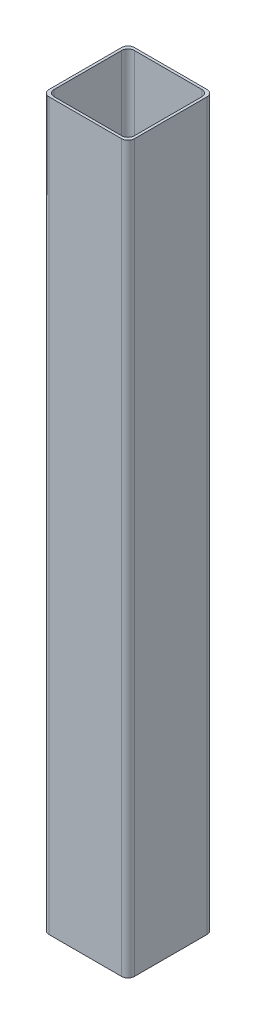
ISO-10303-21;
HEADER;
FILE_DESCRIPTION(('STEP AP214'),'2;1');
FILE_NAME('part.step','',(''),(''),'','','');
FILE_SCHEMA(('AUTOMOTIVE_DESIGN { 1 0 10303 214 1 1 1 1 }'));
ENDSEC;
DATA;
#1=APPLICATION_CONTEXT('core data for automotive mechanical design processes');
#2=APPLICATION_PROTOCOL_DEFINITION('international standard','automotive_design',2000,#1);
#3=PRODUCT_CONTEXT('',#1,'mechanical');
#4=PRODUCT('Part','Part','',(#3));
#5=PRODUCT_RELATED_PRODUCT_CATEGORY('part','',(#4));
#6=PRODUCT_DEFINITION_FORMATION('','',#4);
#7=PRODUCT_DEFINITION_CONTEXT('part definition',#1,'design');
#8=PRODUCT_DEFINITION('design','',#6,#7);
#9=PRODUCT_DEFINITION_SHAPE('','',#8);
#10=(LENGTH_UNIT() NAMED_UNIT(*) SI_UNIT(.MILLI.,.METRE.));
#11=(NAMED_UNIT(*) PLANE_ANGLE_UNIT() SI_UNIT($,.RADIAN.));
#12=(NAMED_UNIT(*) SI_UNIT($,.STERADIAN.) SOLID_ANGLE_UNIT());
#13=UNCERTAINTY_MEASURE_WITH_UNIT(LENGTH_MEASURE(1.E-05),#10,'distance_accuracy_value','');
#14=(GEOMETRIC_REPRESENTATION_CONTEXT(3) GLOBAL_UNCERTAINTY_ASSIGNED_CONTEXT((#13)) GLOBAL_UNIT_ASSIGNED_CONTEXT((#10,
#11,#12)) REPRESENTATION_CONTEXT('',''));
#15=CARTESIAN_POINT('',(0.,0.,0.));
#16=DIRECTION('',(0.,0.,1.));
#17=DIRECTION('',(1.,0.,0.));
#18=AXIS2_PLACEMENT_3D('',#15,#16,#17);
#19=CARTESIAN_POINT('',(0.,170.,0.));
#20=DIRECTION('',(0.,1.,0.));
#21=DIRECTION('',(0.,0.,1.));
#22=AXIS2_PLACEMENT_3D('',#19,#20,#21);
#23=PLANE('',#22);
#24=DIRECTION('',(-1.,0.,0.));
#25=VECTOR('',#24,1.);
#26=CARTESIAN_POINT('',(20.,170.,-20.));
#27=LINE('',#26,#25);
#28=CARTESIAN_POINT('',(17.,170.,-20.));
#29=VERTEX_POINT('',#28);
#30=CARTESIAN_POINT('',(-17.,170.,-20.));
#31=VERTEX_POINT('',#30);
#32=EDGE_CURVE('E183',#29,#31,#27,.T.);
#33=ORIENTED_EDGE('',*,*,#32,.T.);
#34=CARTESIAN_POINT('',(-17.,170.,-17.));
#35=DIRECTION('',(0.,1.,0.));
#36=DIRECTION('',(0.,0.,1.));
#37=AXIS2_PLACEMENT_3D('',#34,#35,#36);
#38=CIRCLE('',#37,3.);
#39=CARTESIAN_POINT('',(-20.,170.,-17.));
#40=VERTEX_POINT('',#39);
#41=EDGE_CURVE('E203',#31,#40,#38,.T.);
#42=ORIENTED_EDGE('',*,*,#41,.T.);
#43=DIRECTION('',(0.,0.,1.));
#44=VECTOR('',#43,1.);
#45=CARTESIAN_POINT('',(-20.,170.,20.));
#46=LINE('',#45,#44);
#47=CARTESIAN_POINT('',(-20.,170.,17.));
#48=VERTEX_POINT('',#47);
#49=EDGE_CURVE('E165',#40,#48,#46,.T.);
#50=ORIENTED_EDGE('',*,*,#49,.T.);
#51=CARTESIAN_POINT('',(-17.,170.,17.));
#52=DIRECTION('',(0.,1.,0.));
#53=DIRECTION('',(0.,0.,1.));
#54=AXIS2_PLACEMENT_3D('',#51,#52,#53);
#55=CIRCLE('',#54,3.);
#56=CARTESIAN_POINT('',(-17.,170.,20.));
#57=VERTEX_POINT('',#56);
#58=EDGE_CURVE('E199',#48,#57,#55,.T.);
#59=ORIENTED_EDGE('',*,*,#58,.T.);
#60=DIRECTION('',(1.,0.,0.));
#61=VECTOR('',#60,1.);
#62=CARTESIAN_POINT('',(20.,170.,20.));
#63=LINE('',#62,#61);
#64=CARTESIAN_POINT('',(17.,170.,20.));
#65=VERTEX_POINT('',#64);
#66=EDGE_CURVE('E275',#57,#65,#63,.T.);
#67=ORIENTED_EDGE('',*,*,#66,.T.);
#68=CARTESIAN_POINT('',(17.,170.,17.));
#69=DIRECTION('',(0.,1.,0.));
#70=DIRECTION('',(0.,0.,1.));
#71=AXIS2_PLACEMENT_3D('',#68,#69,#70);
#72=CIRCLE('',#71,3.);
#73=CARTESIAN_POINT('',(20.,170.,17.));
#74=VERTEX_POINT('',#73);
#75=EDGE_CURVE('E197',#65,#74,#72,.T.);
#76=ORIENTED_EDGE('',*,*,#75,.T.);
#77=DIRECTION('',(0.,0.,-1.));
#78=VECTOR('',#77,1.);
#79=CARTESIAN_POINT('',(20.,170.,20.));
#80=LINE('',#79,#78);
#81=CARTESIAN_POINT('',(20.,170.,-17.));
#82=VERTEX_POINT('',#81);
#83=EDGE_CURVE('E277',#74,#82,#80,.T.);
#84=ORIENTED_EDGE('',*,*,#83,.T.);
#85=CARTESIAN_POINT('',(17.,170.,-17.));
#86=DIRECTION('',(0.,1.,0.));
#87=DIRECTION('',(0.,0.,1.));
#88=AXIS2_PLACEMENT_3D('',#85,#86,#87);
#89=CIRCLE('',#88,3.);
#90=EDGE_CURVE('E201',#82,#29,#89,.T.);
#91=ORIENTED_EDGE('',*,*,#90,.T.);
#92=EDGE_LOOP('',(#33,#42,#50,#59,#67,#76,#84,#91));
#93=FACE_BOUND('',#92,.T.);
#94=DIRECTION('',(0.,0.,-1.));
#95=VECTOR('',#94,1.);
#96=CARTESIAN_POINT('',(18.8,170.,18.8));
#97=LINE('',#96,#95);
#98=CARTESIAN_POINT('',(18.8,170.,15.8));
#99=VERTEX_POINT('',#98);
#100=CARTESIAN_POINT('',(18.8,170.,-15.8));
#101=VERTEX_POINT('',#100);
#102=EDGE_CURVE('E261',#99,#101,#97,.T.);
#103=ORIENTED_EDGE('',*,*,#102,.F.);
#104=CARTESIAN_POINT('',(15.8,170.,15.8));
#105=DIRECTION('',(0.,1.,0.));
#106=DIRECTION('',(0.,0.,1.));
#107=AXIS2_PLACEMENT_3D('',#104,#105,#106);
#108=CIRCLE('',#107,3.);
#109=CARTESIAN_POINT('',(15.8,170.,18.8));
#110=VERTEX_POINT('',#109);
#111=EDGE_CURVE('E240',#99,#110,#108,.F.);
#112=ORIENTED_EDGE('',*,*,#111,.T.);
#113=DIRECTION('',(1.,0.,0.));
#114=VECTOR('',#113,1.);
#115=CARTESIAN_POINT('',(18.8,170.,18.8));
#116=LINE('',#115,#114);
#117=CARTESIAN_POINT('',(-15.8,170.,18.8));
#118=VERTEX_POINT('',#117);
#119=EDGE_CURVE('E256',#118,#110,#116,.T.);
#120=ORIENTED_EDGE('',*,*,#119,.F.);
#121=CARTESIAN_POINT('',(-15.8,170.,15.8));
#122=DIRECTION('',(0.,1.,0.));
#123=DIRECTION('',(0.,0.,1.));
#124=AXIS2_PLACEMENT_3D('',#121,#122,#123);
#125=CIRCLE('',#124,3.);
#126=CARTESIAN_POINT('',(-18.8,170.,15.8));
#127=VERTEX_POINT('',#126);
#128=EDGE_CURVE('E244',#118,#127,#125,.F.);
#129=ORIENTED_EDGE('',*,*,#128,.T.);
#130=DIRECTION('',(0.,0.,1.));
#131=VECTOR('',#130,1.);
#132=CARTESIAN_POINT('',(-18.8,170.,18.8));
#133=LINE('',#132,#131);
#134=CARTESIAN_POINT('',(-18.8,170.,-15.8));
#135=VERTEX_POINT('',#134);
#136=EDGE_CURVE('E174',#135,#127,#133,.T.);
#137=ORIENTED_EDGE('',*,*,#136,.F.);
#138=CARTESIAN_POINT('',(-15.8,170.,-15.8));
#139=DIRECTION('',(0.,1.,0.));
#140=DIRECTION('',(0.,0.,1.));
#141=AXIS2_PLACEMENT_3D('',#138,#139,#140);
#142=CIRCLE('',#141,3.);
#143=CARTESIAN_POINT('',(-15.8,170.,-18.8));
#144=VERTEX_POINT('',#143);
#145=EDGE_CURVE('E11',#135,#144,#142,.F.);
#146=ORIENTED_EDGE('',*,*,#145,.T.);
#147=DIRECTION('',(-1.,0.,0.));
#148=VECTOR('',#147,1.);
#149=CARTESIAN_POINT('',(18.8,170.,-18.8));
#150=LINE('',#149,#148);
#151=CARTESIAN_POINT('',(15.8,170.,-18.8));
#152=VERTEX_POINT('',#151);
#153=EDGE_CURVE('E180',#152,#144,#150,.T.);
#154=ORIENTED_EDGE('',*,*,#153,.F.);
#155=CARTESIAN_POINT('',(15.8,170.,-15.8));
#156=DIRECTION('',(0.,1.,0.));
#157=DIRECTION('',(0.,0.,1.));
#158=AXIS2_PLACEMENT_3D('',#155,#156,#157);
#159=CIRCLE('',#158,3.);
#160=EDGE_CURVE('E236',#152,#101,#159,.F.);
#161=ORIENTED_EDGE('',*,*,#160,.T.);
#162=EDGE_LOOP('',(#103,#112,#120,#129,#137,#146,#154,#161));
#163=FACE_BOUND('',#162,.T.);
#164=ADVANCED_FACE('F32',(#93,#163),#23,.T.);
#165=CARTESIAN_POINT('',(0.,-170.,0.));
#166=DIRECTION('',(0.,1.,0.));
#167=DIRECTION('',(0.,0.,1.));
#168=AXIS2_PLACEMENT_3D('',#165,#166,#167);
#169=PLANE('',#168);
#170=DIRECTION('',(0.,0.,1.));
#171=VECTOR('',#170,1.);
#172=CARTESIAN_POINT('',(-20.,-170.,20.));
#173=LINE('',#172,#171);
#174=CARTESIAN_POINT('',(-20.,-170.,-17.));
#175=VERTEX_POINT('',#174);
#176=CARTESIAN_POINT('',(-20.,-170.,17.));
#177=VERTEX_POINT('',#176);
#178=EDGE_CURVE('E162',#175,#177,#173,.T.);
#179=ORIENTED_EDGE('',*,*,#178,.F.);
#180=CARTESIAN_POINT('',(-17.,-170.,-17.));
#181=DIRECTION('',(0.,1.,0.));
#182=DIRECTION('',(0.,0.,1.));
#183=AXIS2_PLACEMENT_3D('',#180,#181,#182);
#184=CIRCLE('',#183,3.);
#185=CARTESIAN_POINT('',(-17.,-170.,-20.));
#186=VERTEX_POINT('',#185);
#187=EDGE_CURVE('E145',#175,#186,#184,.F.);
#188=ORIENTED_EDGE('',*,*,#187,.T.);
#189=DIRECTION('',(-1.,0.,0.));
#190=VECTOR('',#189,1.);
#191=CARTESIAN_POINT('',(20.,-170.,-20.));
#192=LINE('',#191,#190);
#193=CARTESIAN_POINT('',(17.,-170.,-20.));
#194=VERTEX_POINT('',#193);
#195=EDGE_CURVE('E188',#194,#186,#192,.T.);
#196=ORIENTED_EDGE('',*,*,#195,.F.);
#197=CARTESIAN_POINT('',(17.,-170.,-17.));
#198=DIRECTION('',(0.,1.,0.));
#199=DIRECTION('',(0.,0.,1.));
#200=AXIS2_PLACEMENT_3D('',#197,#198,#199);
#201=CIRCLE('',#200,3.);
#202=CARTESIAN_POINT('',(20.,-170.,-17.));
#203=VERTEX_POINT('',#202);
#204=EDGE_CURVE('E156',#194,#203,#201,.F.);
#205=ORIENTED_EDGE('',*,*,#204,.T.);
#206=DIRECTION('',(0.,0.,-1.));
#207=VECTOR('',#206,1.);
#208=CARTESIAN_POINT('',(20.,-170.,20.));
#209=LINE('',#208,#207);
#210=CARTESIAN_POINT('',(20.,-170.,17.));
#211=VERTEX_POINT('',#210);
#212=EDGE_CURVE('E177',#211,#203,#209,.T.);
#213=ORIENTED_EDGE('',*,*,#212,.F.);
#214=CARTESIAN_POINT('',(17.,-170.,17.));
#215=DIRECTION('',(0.,1.,0.));
#216=DIRECTION('',(0.,0.,1.));
#217=AXIS2_PLACEMENT_3D('',#214,#215,#216);
#218=CIRCLE('',#217,3.);
#219=CARTESIAN_POINT('',(17.,-170.,20.));
#220=VERTEX_POINT('',#219);
#221=EDGE_CURVE('E166',#211,#220,#218,.F.);
#222=ORIENTED_EDGE('',*,*,#221,.T.);
#223=DIRECTION('',(1.,0.,0.));
#224=VECTOR('',#223,1.);
#225=CARTESIAN_POINT('',(20.,-170.,20.));
#226=LINE('',#225,#224);
#227=CARTESIAN_POINT('',(-17.,-170.,20.));
#228=VERTEX_POINT('',#227);
#229=EDGE_CURVE('E173',#228,#220,#226,.T.);
#230=ORIENTED_EDGE('',*,*,#229,.F.);
#231=CARTESIAN_POINT('',(-17.,-170.,17.));
#232=DIRECTION('',(0.,1.,0.));
#233=DIRECTION('',(0.,0.,1.));
#234=AXIS2_PLACEMENT_3D('',#231,#232,#233);
#235=CIRCLE('',#234,3.);
#236=EDGE_CURVE('E172',#228,#177,#235,.F.);
#237=ORIENTED_EDGE('',*,*,#236,.T.);
#238=EDGE_LOOP('',(#179,#188,#196,#205,#213,#222,#230,#237));
#239=FACE_BOUND('',#238,.T.);
#240=DIRECTION('',(0.,0.,1.));
#241=VECTOR('',#240,1.);
#242=CARTESIAN_POINT('',(-18.8,-170.,18.8));
#243=LINE('',#242,#241);
#244=CARTESIAN_POINT('',(-18.8,-170.,-15.8));
#245=VERTEX_POINT('',#244);
#246=CARTESIAN_POINT('',(-18.8,-170.,15.8));
#247=VERTEX_POINT('',#246);
#248=EDGE_CURVE('E248',#245,#247,#243,.T.);
#249=ORIENTED_EDGE('',*,*,#248,.T.);
#250=CARTESIAN_POINT('',(-15.8,-170.,15.8));
#251=DIRECTION('',(0.,1.,0.));
#252=DIRECTION('',(0.,0.,1.));
#253=AXIS2_PLACEMENT_3D('',#250,#251,#252);
#254=CIRCLE('',#253,3.);
#255=CARTESIAN_POINT('',(-15.8,-170.,18.8));
#256=VERTEX_POINT('',#255);
#257=EDGE_CURVE('E242',#247,#256,#254,.T.);
#258=ORIENTED_EDGE('',*,*,#257,.T.);
#259=DIRECTION('',(1.,0.,0.));
#260=VECTOR('',#259,1.);
#261=CARTESIAN_POINT('',(18.8,-170.,18.8));
#262=LINE('',#261,#260);
#263=CARTESIAN_POINT('',(15.8,-170.,18.8));
#264=VERTEX_POINT('',#263);
#265=EDGE_CURVE('E267',#256,#264,#262,.T.);
#266=ORIENTED_EDGE('',*,*,#265,.T.);
#267=CARTESIAN_POINT('',(15.8,-170.,15.8));
#268=DIRECTION('',(0.,1.,0.));
#269=DIRECTION('',(0.,0.,1.));
#270=AXIS2_PLACEMENT_3D('',#267,#268,#269);
#271=CIRCLE('',#270,3.);
#272=CARTESIAN_POINT('',(18.8,-170.,15.8));
#273=VERTEX_POINT('',#272);
#274=EDGE_CURVE('E238',#264,#273,#271,.T.);
#275=ORIENTED_EDGE('',*,*,#274,.T.);
#276=DIRECTION('',(0.,0.,-1.));
#277=VECTOR('',#276,1.);
#278=CARTESIAN_POINT('',(18.8,-170.,18.8));
#279=LINE('',#278,#277);
#280=CARTESIAN_POINT('',(18.8,-170.,-15.8));
#281=VERTEX_POINT('',#280);
#282=EDGE_CURVE('E270',#273,#281,#279,.T.);
#283=ORIENTED_EDGE('',*,*,#282,.T.);
#284=CARTESIAN_POINT('',(15.8,-170.,-15.8));
#285=DIRECTION('',(0.,1.,0.));
#286=DIRECTION('',(0.,0.,1.));
#287=AXIS2_PLACEMENT_3D('',#284,#285,#286);
#288=CIRCLE('',#287,3.);
#289=CARTESIAN_POINT('',(15.8,-170.,-18.8));
#290=VERTEX_POINT('',#289);
#291=EDGE_CURVE('E234',#281,#290,#288,.T.);
#292=ORIENTED_EDGE('',*,*,#291,.T.);
#293=DIRECTION('',(-1.,0.,0.));
#294=VECTOR('',#293,1.);
#295=CARTESIAN_POINT('',(18.8,-170.,-18.8));
#296=LINE('',#295,#294);
#297=CARTESIAN_POINT('',(-15.8,-170.,-18.8));
#298=VERTEX_POINT('',#297);
#299=EDGE_CURVE('E249',#290,#298,#296,.T.);
#300=ORIENTED_EDGE('',*,*,#299,.T.);
#301=CARTESIAN_POINT('',(-15.8,-170.,-15.8));
#302=DIRECTION('',(0.,1.,0.));
#303=DIRECTION('',(0.,0.,1.));
#304=AXIS2_PLACEMENT_3D('',#301,#302,#303);
#305=CIRCLE('',#304,3.);
#306=EDGE_CURVE('E40',#298,#245,#305,.T.);
#307=ORIENTED_EDGE('',*,*,#306,.T.);
#308=EDGE_LOOP('',(#249,#258,#266,#275,#283,#292,#300,#307));
#309=FACE_BOUND('',#308,.T.);
#310=ADVANCED_FACE('F169',(#239,#309),#169,.F.);
#311=CARTESIAN_POINT('',(-20.,170.,20.));
#312=DIRECTION('',(1.,0.,0.));
#313=DIRECTION('',(0.,0.,-1.));
#314=AXIS2_PLACEMENT_3D('',#311,#312,#313);
#315=PLANE('',#314);
#316=ORIENTED_EDGE('',*,*,#49,.F.);
#317=DIRECTION('',(0.,-1.,0.));
#318=VECTOR('',#317,1.);
#319=CARTESIAN_POINT('',(-20.,170.,-17.));
#320=LINE('',#319,#318);
#321=EDGE_CURVE('E149',#40,#175,#320,.T.);
#322=ORIENTED_EDGE('',*,*,#321,.T.);
#323=ORIENTED_EDGE('',*,*,#178,.T.);
#324=DIRECTION('',(0.,-1.,0.));
#325=VECTOR('',#324,1.);
#326=CARTESIAN_POINT('',(-20.,170.,17.));
#327=LINE('',#326,#325);
#328=EDGE_CURVE('E167',#177,#48,#327,.F.);
#329=ORIENTED_EDGE('',*,*,#328,.T.);
#330=EDGE_LOOP('',(#316,#322,#323,#329));
#331=FACE_BOUND('',#330,.T.);
#332=ADVANCED_FACE('F161',(#331),#315,.F.);
#333=CARTESIAN_POINT('',(20.,170.,20.));
#334=DIRECTION('',(0.,0.,-1.));
#335=DIRECTION('',(-1.,0.,0.));
#336=AXIS2_PLACEMENT_3D('',#333,#334,#335);
#337=PLANE('',#336);
#338=ORIENTED_EDGE('',*,*,#66,.F.);
#339=DIRECTION('',(0.,-1.,0.));
#340=VECTOR('',#339,1.);
#341=CARTESIAN_POINT('',(-17.,170.,20.));
#342=LINE('',#341,#340);
#343=EDGE_CURVE('E231',#57,#228,#342,.T.);
#344=ORIENTED_EDGE('',*,*,#343,.T.);
#345=ORIENTED_EDGE('',*,*,#229,.T.);
#346=DIRECTION('',(0.,-1.,0.));
#347=VECTOR('',#346,1.);
#348=CARTESIAN_POINT('',(17.,170.,20.));
#349=LINE('',#348,#347);
#350=EDGE_CURVE('E229',#220,#65,#349,.F.);
#351=ORIENTED_EDGE('',*,*,#350,.T.);
#352=EDGE_LOOP('',(#338,#344,#345,#351));
#353=FACE_BOUND('',#352,.T.);
#354=ADVANCED_FACE('F299',(#353),#337,.F.);
#355=CARTESIAN_POINT('',(20.,170.,20.));
#356=DIRECTION('',(-1.,0.,0.));
#357=DIRECTION('',(0.,0.,1.));
#358=AXIS2_PLACEMENT_3D('',#355,#356,#357);
#359=PLANE('',#358);
#360=ORIENTED_EDGE('',*,*,#212,.T.);
#361=DIRECTION('',(0.,-1.,0.));
#362=VECTOR('',#361,1.);
#363=CARTESIAN_POINT('',(20.,170.,-17.));
#364=LINE('',#363,#362);
#365=EDGE_CURVE('E208',#203,#82,#364,.F.);
#366=ORIENTED_EDGE('',*,*,#365,.T.);
#367=ORIENTED_EDGE('',*,*,#83,.F.);
#368=DIRECTION('',(0.,-1.,0.));
#369=VECTOR('',#368,1.);
#370=CARTESIAN_POINT('',(20.,170.,17.));
#371=LINE('',#370,#369);
#372=EDGE_CURVE('E205',#74,#211,#371,.T.);
#373=ORIENTED_EDGE('',*,*,#372,.T.);
#374=EDGE_LOOP('',(#360,#366,#367,#373));
#375=FACE_BOUND('',#374,.T.);
#376=ADVANCED_FACE('F292',(#375),#359,.F.);
#377=CARTESIAN_POINT('',(20.,170.,-20.));
#378=DIRECTION('',(0.,0.,1.));
#379=DIRECTION('',(1.,0.,0.));
#380=AXIS2_PLACEMENT_3D('',#377,#378,#379);
#381=PLANE('',#380);
#382=ORIENTED_EDGE('',*,*,#195,.T.);
#383=DIRECTION('',(0.,-1.,0.));
#384=VECTOR('',#383,1.);
#385=CARTESIAN_POINT('',(-17.,170.,-20.));
#386=LINE('',#385,#384);
#387=EDGE_CURVE('E150',#186,#31,#386,.F.);
#388=ORIENTED_EDGE('',*,*,#387,.T.);
#389=ORIENTED_EDGE('',*,*,#32,.F.);
#390=DIRECTION('',(0.,-1.,0.));
#391=VECTOR('',#390,1.);
#392=CARTESIAN_POINT('',(17.,170.,-20.));
#393=LINE('',#392,#391);
#394=EDGE_CURVE('E155',#29,#194,#393,.T.);
#395=ORIENTED_EDGE('',*,*,#394,.T.);
#396=EDGE_LOOP('',(#382,#388,#389,#395));
#397=FACE_BOUND('',#396,.T.);
#398=ADVANCED_FACE('F286',(#397),#381,.F.);
#399=CARTESIAN_POINT('',(18.8,170.,18.8));
#400=DIRECTION('',(0.,0.,-1.));
#401=DIRECTION('',(-1.,0.,0.));
#402=AXIS2_PLACEMENT_3D('',#399,#400,#401);
#403=PLANE('',#402);
#404=ORIENTED_EDGE('',*,*,#119,.T.);
#405=DIRECTION('',(0.,-1.,0.));
#406=VECTOR('',#405,1.);
#407=CARTESIAN_POINT('',(15.8,-170.,18.8));
#408=LINE('',#407,#406);
#409=EDGE_CURVE('E221',#110,#264,#408,.T.);
#410=ORIENTED_EDGE('',*,*,#409,.T.);
#411=ORIENTED_EDGE('',*,*,#265,.F.);
#412=DIRECTION('',(0.,-1.,0.));
#413=VECTOR('',#412,1.);
#414=CARTESIAN_POINT('',(-15.8,170.,18.8));
#415=LINE('',#414,#413);
#416=EDGE_CURVE('E219',#256,#118,#415,.F.);
#417=ORIENTED_EDGE('',*,*,#416,.T.);
#418=EDGE_LOOP('',(#404,#410,#411,#417));
#419=FACE_BOUND('',#418,.T.);
#420=ADVANCED_FACE('F318',(#419),#403,.T.);
#421=CARTESIAN_POINT('',(18.8,170.,18.8));
#422=DIRECTION('',(-1.,0.,0.));
#423=DIRECTION('',(0.,0.,1.));
#424=AXIS2_PLACEMENT_3D('',#421,#422,#423);
#425=PLANE('',#424);
#426=ORIENTED_EDGE('',*,*,#102,.T.);
#427=DIRECTION('',(0.,-1.,0.));
#428=VECTOR('',#427,1.);
#429=CARTESIAN_POINT('',(18.8,-170.,-15.8));
#430=LINE('',#429,#428);
#431=EDGE_CURVE('E212',#101,#281,#430,.T.);
#432=ORIENTED_EDGE('',*,*,#431,.T.);
#433=ORIENTED_EDGE('',*,*,#282,.F.);
#434=DIRECTION('',(0.,-1.,0.));
#435=VECTOR('',#434,1.);
#436=CARTESIAN_POINT('',(18.8,170.,15.8));
#437=LINE('',#436,#435);
#438=EDGE_CURVE('E210',#273,#99,#437,.F.);
#439=ORIENTED_EDGE('',*,*,#438,.T.);
#440=EDGE_LOOP('',(#426,#432,#433,#439));
#441=FACE_BOUND('',#440,.T.);
#442=ADVANCED_FACE('F357',(#441),#425,.T.);
#443=CARTESIAN_POINT('',(18.8,170.,-18.8));
#444=DIRECTION('',(0.,0.,1.));
#445=DIRECTION('',(1.,0.,0.));
#446=AXIS2_PLACEMENT_3D('',#443,#444,#445);
#447=PLANE('',#446);
#448=ORIENTED_EDGE('',*,*,#299,.F.);
#449=DIRECTION('',(0.,-1.,0.));
#450=VECTOR('',#449,1.);
#451=CARTESIAN_POINT('',(15.8,170.,-18.8));
#452=LINE('',#451,#450);
#453=EDGE_CURVE('E52',#290,#152,#452,.F.);
#454=ORIENTED_EDGE('',*,*,#453,.T.);
#455=ORIENTED_EDGE('',*,*,#153,.T.);
#456=DIRECTION('',(0.,-1.,0.));
#457=VECTOR('',#456,1.);
#458=CARTESIAN_POINT('',(-15.8,-170.,-18.8));
#459=LINE('',#458,#457);
#460=EDGE_CURVE('E215',#144,#298,#459,.T.);
#461=ORIENTED_EDGE('',*,*,#460,.T.);
#462=EDGE_LOOP('',(#448,#454,#455,#461));
#463=FACE_BOUND('',#462,.T.);
#464=ADVANCED_FACE('F259',(#463),#447,.T.);
#465=CARTESIAN_POINT('',(-18.8,170.,18.8));
#466=DIRECTION('',(1.,0.,0.));
#467=DIRECTION('',(0.,0.,-1.));
#468=AXIS2_PLACEMENT_3D('',#465,#466,#467);
#469=PLANE('',#468);
#470=ORIENTED_EDGE('',*,*,#136,.T.);
#471=DIRECTION('',(0.,-1.,0.));
#472=VECTOR('',#471,1.);
#473=CARTESIAN_POINT('',(-18.8,-170.,15.8));
#474=LINE('',#473,#472);
#475=EDGE_CURVE('E226',#127,#247,#474,.T.);
#476=ORIENTED_EDGE('',*,*,#475,.T.);
#477=ORIENTED_EDGE('',*,*,#248,.F.);
#478=DIRECTION('',(0.,-1.,0.));
#479=VECTOR('',#478,1.);
#480=CARTESIAN_POINT('',(-18.8,170.,-15.8));
#481=LINE('',#480,#479);
#482=EDGE_CURVE('E224',#245,#135,#481,.F.);
#483=ORIENTED_EDGE('',*,*,#482,.T.);
#484=EDGE_LOOP('',(#470,#476,#477,#483));
#485=FACE_BOUND('',#484,.T.);
#486=ADVANCED_FACE('F254',(#485),#469,.T.);
#487=CARTESIAN_POINT('',(-17.,170.,-17.));
#488=DIRECTION('',(0.,-1.,0.));
#489=DIRECTION('',(0.,0.,-1.));
#490=AXIS2_PLACEMENT_3D('',#487,#488,#489);
#491=CYLINDRICAL_SURFACE('',#490,3.);
#492=ORIENTED_EDGE('',*,*,#41,.F.);
#493=ORIENTED_EDGE('',*,*,#387,.F.);
#494=ORIENTED_EDGE('',*,*,#187,.F.);
#495=ORIENTED_EDGE('',*,*,#321,.F.);
#496=EDGE_LOOP('',(#492,#493,#494,#495));
#497=FACE_BOUND('',#496,.T.);
#498=ADVANCED_FACE('F148',(#497),#491,.T.);
#499=CARTESIAN_POINT('',(17.,170.,-17.));
#500=DIRECTION('',(0.,-1.,0.));
#501=DIRECTION('',(0.,0.,-1.));
#502=AXIS2_PLACEMENT_3D('',#499,#500,#501);
#503=CYLINDRICAL_SURFACE('',#502,3.);
#504=ORIENTED_EDGE('',*,*,#90,.F.);
#505=ORIENTED_EDGE('',*,*,#365,.F.);
#506=ORIENTED_EDGE('',*,*,#204,.F.);
#507=ORIENTED_EDGE('',*,*,#394,.F.);
#508=EDGE_LOOP('',(#504,#505,#506,#507));
#509=FACE_BOUND('',#508,.T.);
#510=ADVANCED_FACE('F288',(#509),#503,.T.);
#511=CARTESIAN_POINT('',(15.8,170.,-15.8));
#512=DIRECTION('',(0.,1.,0.));
#513=DIRECTION('',(0.,0.,1.));
#514=AXIS2_PLACEMENT_3D('',#511,#512,#513);
#515=CYLINDRICAL_SURFACE('',#514,3.);
#516=ORIENTED_EDGE('',*,*,#160,.F.);
#517=ORIENTED_EDGE('',*,*,#453,.F.);
#518=ORIENTED_EDGE('',*,*,#291,.F.);
#519=ORIENTED_EDGE('',*,*,#431,.F.);
#520=EDGE_LOOP('',(#516,#517,#518,#519));
#521=FACE_BOUND('',#520,.T.);
#522=ADVANCED_FACE('F333',(#521),#515,.F.);
#523=CARTESIAN_POINT('',(15.8,170.,15.8));
#524=DIRECTION('',(0.,1.,0.));
#525=DIRECTION('',(0.,0.,1.));
#526=AXIS2_PLACEMENT_3D('',#523,#524,#525);
#527=CYLINDRICAL_SURFACE('',#526,3.);
#528=ORIENTED_EDGE('',*,*,#111,.F.);
#529=ORIENTED_EDGE('',*,*,#438,.F.);
#530=ORIENTED_EDGE('',*,*,#274,.F.);
#531=ORIENTED_EDGE('',*,*,#409,.F.);
#532=EDGE_LOOP('',(#528,#529,#530,#531));
#533=FACE_BOUND('',#532,.T.);
#534=ADVANCED_FACE('F336',(#533),#527,.F.);
#535=CARTESIAN_POINT('',(-15.8,170.,15.8));
#536=DIRECTION('',(0.,1.,0.));
#537=DIRECTION('',(0.,0.,1.));
#538=AXIS2_PLACEMENT_3D('',#535,#536,#537);
#539=CYLINDRICAL_SURFACE('',#538,3.);
#540=ORIENTED_EDGE('',*,*,#128,.F.);
#541=ORIENTED_EDGE('',*,*,#416,.F.);
#542=ORIENTED_EDGE('',*,*,#257,.F.);
#543=ORIENTED_EDGE('',*,*,#475,.F.);
#544=EDGE_LOOP('',(#540,#541,#542,#543));
#545=FACE_BOUND('',#544,.T.);
#546=ADVANCED_FACE('F309',(#545),#539,.F.);
#547=CARTESIAN_POINT('',(-15.8,170.,-15.8));
#548=DIRECTION('',(0.,1.,0.));
#549=DIRECTION('',(0.,0.,1.));
#550=AXIS2_PLACEMENT_3D('',#547,#548,#549);
#551=CYLINDRICAL_SURFACE('',#550,3.);
#552=ORIENTED_EDGE('',*,*,#145,.F.);
#553=ORIENTED_EDGE('',*,*,#482,.F.);
#554=ORIENTED_EDGE('',*,*,#306,.F.);
#555=ORIENTED_EDGE('',*,*,#460,.F.);
#556=EDGE_LOOP('',(#552,#553,#554,#555));
#557=FACE_BOUND('',#556,.T.);
#558=ADVANCED_FACE('F258',(#557),#551,.F.);
#559=CARTESIAN_POINT('',(-17.,170.,17.));
#560=DIRECTION('',(0.,-1.,0.));
#561=DIRECTION('',(0.,0.,-1.));
#562=AXIS2_PLACEMENT_3D('',#559,#560,#561);
#563=CYLINDRICAL_SURFACE('',#562,3.);
#564=ORIENTED_EDGE('',*,*,#58,.F.);
#565=ORIENTED_EDGE('',*,*,#328,.F.);
#566=ORIENTED_EDGE('',*,*,#236,.F.);
#567=ORIENTED_EDGE('',*,*,#343,.F.);
#568=EDGE_LOOP('',(#564,#565,#566,#567));
#569=FACE_BOUND('',#568,.T.);
#570=ADVANCED_FACE('F303',(#569),#563,.T.);
#571=CARTESIAN_POINT('',(17.,170.,17.));
#572=DIRECTION('',(0.,-1.,0.));
#573=DIRECTION('',(0.,0.,-1.));
#574=AXIS2_PLACEMENT_3D('',#571,#572,#573);
#575=CYLINDRICAL_SURFACE('',#574,3.);
#576=ORIENTED_EDGE('',*,*,#75,.F.);
#577=ORIENTED_EDGE('',*,*,#350,.F.);
#578=ORIENTED_EDGE('',*,*,#221,.F.);
#579=ORIENTED_EDGE('',*,*,#372,.F.);
#580=EDGE_LOOP('',(#576,#577,#578,#579));
#581=FACE_BOUND('',#580,.T.);
#582=ADVANCED_FACE('F34',(#581),#575,.T.);
#583=CLOSED_SHELL('',(#164,#310,#332,#354,#376,#398,#420,#442,#464,#486,#498,#510,#522,#534,
#546,#558,#570,#582));
#584=MANIFOLD_SOLID_BREP('B2',#583);
#585=ADVANCED_BREP_SHAPE_REPRESENTATION('',(#18,#584),#14);
#586=SHAPE_DEFINITION_REPRESENTATION(#9,#585);
ENDSEC;
END-ISO-10303-21;
